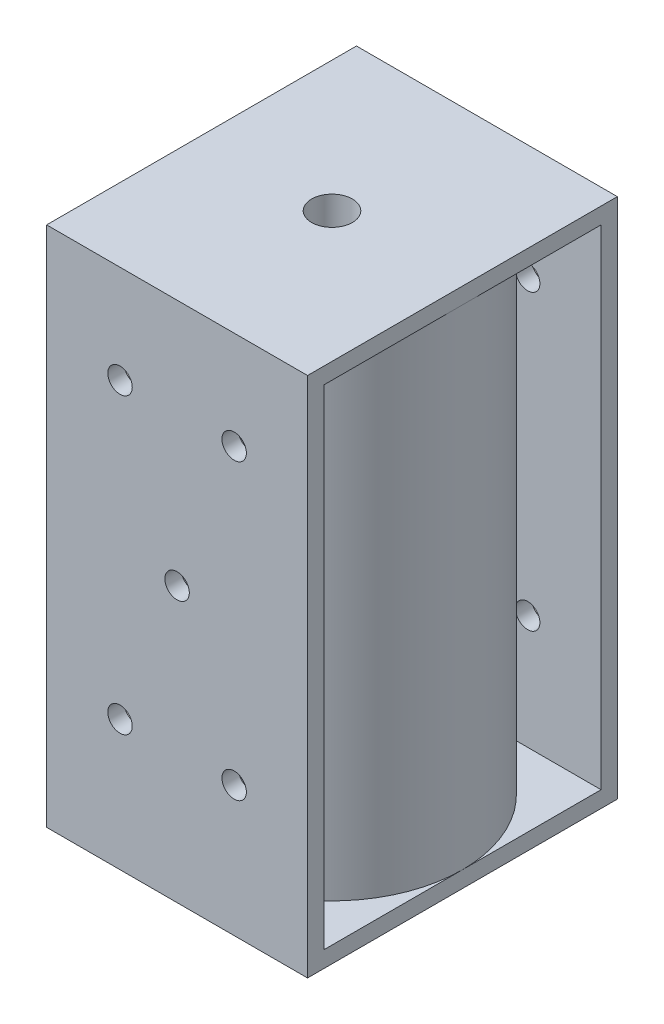
ISO-10303-21;
HEADER;
FILE_DESCRIPTION(('STEP AP214'),'2;1');
FILE_NAME('part.step','',(''),(''),'','','');
FILE_SCHEMA(('AUTOMOTIVE_DESIGN { 1 0 10303 214 1 1 1 1 }'));
ENDSEC;
DATA;
#1=APPLICATION_CONTEXT('core data for automotive mechanical design processes');
#2=APPLICATION_PROTOCOL_DEFINITION('international standard','automotive_design',2000,#1);
#3=PRODUCT_CONTEXT('',#1,'mechanical');
#4=PRODUCT('Part','Part','',(#3));
#5=PRODUCT_RELATED_PRODUCT_CATEGORY('part','',(#4));
#6=PRODUCT_DEFINITION_FORMATION('','',#4);
#7=PRODUCT_DEFINITION_CONTEXT('part definition',#1,'design');
#8=PRODUCT_DEFINITION('design','',#6,#7);
#9=PRODUCT_DEFINITION_SHAPE('','',#8);
#10=(LENGTH_UNIT() NAMED_UNIT(*) SI_UNIT(.MILLI.,.METRE.));
#11=(NAMED_UNIT(*) PLANE_ANGLE_UNIT() SI_UNIT($,.RADIAN.));
#12=(NAMED_UNIT(*) SI_UNIT($,.STERADIAN.) SOLID_ANGLE_UNIT());
#13=UNCERTAINTY_MEASURE_WITH_UNIT(LENGTH_MEASURE(1.E-05),#10,'distance_accuracy_value','');
#14=(GEOMETRIC_REPRESENTATION_CONTEXT(3) GLOBAL_UNCERTAINTY_ASSIGNED_CONTEXT((#13)) GLOBAL_UNIT_ASSIGNED_CONTEXT((#10,
#11,#12)) REPRESENTATION_CONTEXT('',''));
#15=CARTESIAN_POINT('',(0.,0.,0.));
#16=DIRECTION('',(0.,0.,1.));
#17=DIRECTION('',(1.,0.,0.));
#18=AXIS2_PLACEMENT_3D('',#15,#16,#17);
#19=CARTESIAN_POINT('',(16.,-32.,0.));
#20=DIRECTION('',(0.,1.,0.));
#21=DIRECTION('',(0.,0.,1.));
#22=AXIS2_PLACEMENT_3D('',#19,#20,#21);
#23=CYLINDRICAL_SURFACE('',#22,2.5);
#24=CARTESIAN_POINT('',(16.,32.,0.));
#25=DIRECTION('',(0.,1.,0.));
#26=DIRECTION('',(0.,0.,1.));
#27=AXIS2_PLACEMENT_3D('',#24,#25,#26);
#28=CIRCLE('',#27,2.5);
#29=CARTESIAN_POINT('',(16.,32.,2.5));
#30=VERTEX_POINT('',#29);
#31=EDGE_CURVE('E120',#30,#30,#28,.T.);
#32=ORIENTED_EDGE('',*,*,#31,.T.);
#33=EDGE_LOOP('',(#32));
#34=FACE_BOUND('',#33,.T.);
#35=CARTESIAN_POINT('',(16.,8.00000000000001,0.));
#36=DIRECTION('',(0.,-1.,0.));
#37=DIRECTION('',(0.,0.,-1.));
#38=AXIS2_PLACEMENT_3D('',#35,#36,#37);
#39=CIRCLE('',#38,2.5);
#40=CARTESIAN_POINT('',(16.,8.00000000000001,-2.5));
#41=VERTEX_POINT('',#40);
#42=EDGE_CURVE('E36',#41,#41,#39,.F.);
#43=ORIENTED_EDGE('',*,*,#42,.F.);
#44=EDGE_LOOP('',(#43));
#45=FACE_BOUND('',#44,.T.);
#46=ADVANCED_FACE('F32',(#34,#45),#23,.F.);
#47=CARTESIAN_POINT('',(32.,-30.,17.));
#48=DIRECTION('',(0.,1.,0.));
#49=DIRECTION('',(0.,0.,1.));
#50=AXIS2_PLACEMENT_3D('',#47,#48,#49);
#51=PLANE('',#50);
#52=DIRECTION('',(0.,0.,-1.));
#53=VECTOR('',#52,1.);
#54=CARTESIAN_POINT('',(0.,-30.,17.));
#55=LINE('',#54,#53);
#56=CARTESIAN_POINT('',(0.,-29.9999999999727,0.));
#57=VERTEX_POINT('',#56);
#58=CARTESIAN_POINT('',(0.,-30.,-17.));
#59=VERTEX_POINT('',#58);
#60=EDGE_CURVE('E144',#57,#59,#55,.T.);
#61=ORIENTED_EDGE('',*,*,#60,.F.);
#62=CARTESIAN_POINT('',(16.,-30.,0.));
#63=DIRECTION('',(0.,1.,0.));
#64=DIRECTION('',(0.,0.,1.));
#65=AXIS2_PLACEMENT_3D('',#62,#63,#64);
#66=CIRCLE('',#65,16.);
#67=CARTESIAN_POINT('',(32.,-30.,0.));
#68=VERTEX_POINT('',#67);
#69=EDGE_CURVE('E47',#68,#57,#66,.T.);
#70=ORIENTED_EDGE('',*,*,#69,.F.);
#71=DIRECTION('',(0.,0.,-1.));
#72=VECTOR('',#71,1.);
#73=CARTESIAN_POINT('',(32.,-30.,17.));
#74=LINE('',#73,#72);
#75=CARTESIAN_POINT('',(32.,-30.,-17.));
#76=VERTEX_POINT('',#75);
#77=EDGE_CURVE('E152',#68,#76,#74,.T.);
#78=ORIENTED_EDGE('',*,*,#77,.T.);
#79=DIRECTION('',(-1.,0.,0.));
#80=VECTOR('',#79,1.);
#81=CARTESIAN_POINT('',(32.,-30.,-17.));
#82=LINE('',#81,#80);
#83=EDGE_CURVE('E158',#76,#59,#82,.T.);
#84=ORIENTED_EDGE('',*,*,#83,.T.);
#85=EDGE_LOOP('',(#61,#70,#78,#84));
#86=FACE_BOUND('',#85,.T.);
#87=ADVANCED_FACE('F236',(#86),#51,.T.);
#88=CARTESIAN_POINT('',(32.,30.,17.));
#89=DIRECTION('',(0.,-1.,0.));
#90=DIRECTION('',(0.,0.,-1.));
#91=AXIS2_PLACEMENT_3D('',#88,#89,#90);
#92=PLANE('',#91);
#93=DIRECTION('',(0.,0.,1.));
#94=VECTOR('',#93,1.);
#95=CARTESIAN_POINT('',(0.,30.,17.));
#96=LINE('',#95,#94);
#97=CARTESIAN_POINT('',(0.,29.9999999999727,0.));
#98=VERTEX_POINT('',#97);
#99=CARTESIAN_POINT('',(0.,30.,17.));
#100=VERTEX_POINT('',#99);
#101=EDGE_CURVE('E117',#98,#100,#96,.T.);
#102=ORIENTED_EDGE('',*,*,#101,.F.);
#103=CARTESIAN_POINT('',(16.,29.9999999999727,0.));
#104=DIRECTION('',(0.,-1.,0.));
#105=DIRECTION('',(0.,0.,-1.));
#106=AXIS2_PLACEMENT_3D('',#103,#104,#105);
#107=CIRCLE('',#106,16.);
#108=CARTESIAN_POINT('',(32.,29.9999999999727,0.));
#109=VERTEX_POINT('',#108);
#110=EDGE_CURVE('E54',#109,#98,#107,.T.);
#111=ORIENTED_EDGE('',*,*,#110,.F.);
#112=DIRECTION('',(0.,0.,1.));
#113=VECTOR('',#112,1.);
#114=CARTESIAN_POINT('',(32.,30.,17.));
#115=LINE('',#114,#113);
#116=CARTESIAN_POINT('',(32.,30.,17.));
#117=VERTEX_POINT('',#116);
#118=EDGE_CURVE('E115',#109,#117,#115,.T.);
#119=ORIENTED_EDGE('',*,*,#118,.T.);
#120=DIRECTION('',(-1.,0.,0.));
#121=VECTOR('',#120,1.);
#122=CARTESIAN_POINT('',(32.,30.,17.));
#123=LINE('',#122,#121);
#124=EDGE_CURVE('E155',#117,#100,#123,.T.);
#125=ORIENTED_EDGE('',*,*,#124,.T.);
#126=EDGE_LOOP('',(#102,#111,#119,#125));
#127=FACE_BOUND('',#126,.T.);
#128=ADVANCED_FACE('F113',(#127),#92,.T.);
#129=CARTESIAN_POINT('',(32.,0.,0.));
#130=DIRECTION('',(-1.,0.,0.));
#131=DIRECTION('',(0.,0.,1.));
#132=AXIS2_PLACEMENT_3D('',#129,#130,#131);
#133=PLANE('',#132);
#134=DIRECTION('',(0.,1.,0.));
#135=VECTOR('',#134,1.);
#136=CARTESIAN_POINT('',(32.,-32.,-19.));
#137=LINE('',#136,#135);
#138=CARTESIAN_POINT('',(32.,-32.,-19.));
#139=VERTEX_POINT('',#138);
#140=CARTESIAN_POINT('',(32.,32.,-19.));
#141=VERTEX_POINT('',#140);
#142=EDGE_CURVE('E162',#139,#141,#137,.T.);
#143=ORIENTED_EDGE('',*,*,#142,.T.);
#144=DIRECTION('',(0.,0.,1.));
#145=VECTOR('',#144,1.);
#146=CARTESIAN_POINT('',(32.,32.,19.));
#147=LINE('',#146,#145);
#148=CARTESIAN_POINT('',(32.,32.,19.));
#149=VERTEX_POINT('',#148);
#150=EDGE_CURVE('E165',#141,#149,#147,.T.);
#151=ORIENTED_EDGE('',*,*,#150,.T.);
#152=DIRECTION('',(0.,-1.,0.));
#153=VECTOR('',#152,1.);
#154=CARTESIAN_POINT('',(32.,-32.,19.));
#155=LINE('',#154,#153);
#156=CARTESIAN_POINT('',(32.,-32.,19.));
#157=VERTEX_POINT('',#156);
#158=EDGE_CURVE('E168',#149,#157,#155,.T.);
#159=ORIENTED_EDGE('',*,*,#158,.T.);
#160=DIRECTION('',(0.,0.,-1.));
#161=VECTOR('',#160,1.);
#162=CARTESIAN_POINT('',(32.,-32.,19.));
#163=LINE('',#162,#161);
#164=EDGE_CURVE('E170',#157,#139,#163,.T.);
#165=ORIENTED_EDGE('',*,*,#164,.T.);
#166=EDGE_LOOP('',(#143,#151,#159,#165));
#167=FACE_BOUND('',#166,.T.);
#168=CARTESIAN_POINT('',(32.,-30.,17.));
#169=VERTEX_POINT('',#168);
#170=EDGE_CURVE('E228',#169,#68,#74,.T.);
#171=ORIENTED_EDGE('',*,*,#170,.F.);
#172=DIRECTION('',(0.,-1.,0.));
#173=VECTOR('',#172,1.);
#174=CARTESIAN_POINT('',(32.,-30.,17.));
#175=LINE('',#174,#173);
#176=EDGE_CURVE('E129',#117,#169,#175,.T.);
#177=ORIENTED_EDGE('',*,*,#176,.F.);
#178=ORIENTED_EDGE('',*,*,#118,.F.);
#179=CARTESIAN_POINT('',(32.,30.,-17.));
#180=VERTEX_POINT('',#179);
#181=EDGE_CURVE('E128',#180,#109,#115,.T.);
#182=ORIENTED_EDGE('',*,*,#181,.F.);
#183=DIRECTION('',(0.,1.,0.));
#184=VECTOR('',#183,1.);
#185=CARTESIAN_POINT('',(32.,-30.,-17.));
#186=LINE('',#185,#184);
#187=EDGE_CURVE('E130',#76,#180,#186,.T.);
#188=ORIENTED_EDGE('',*,*,#187,.F.);
#189=ORIENTED_EDGE('',*,*,#77,.F.);
#190=EDGE_LOOP('',(#171,#177,#178,#182,#188,#189));
#191=FACE_BOUND('',#190,.T.);
#192=ADVANCED_FACE('F126',(#167,#191),#133,.F.);
#193=CARTESIAN_POINT('',(0.,0.,0.));
#194=DIRECTION('',(-1.,0.,0.));
#195=DIRECTION('',(0.,0.,1.));
#196=AXIS2_PLACEMENT_3D('',#193,#194,#195);
#197=PLANE('',#196);
#198=DIRECTION('',(0.,1.,0.));
#199=VECTOR('',#198,1.);
#200=CARTESIAN_POINT('',(0.,-32.,-19.));
#201=LINE('',#200,#199);
#202=CARTESIAN_POINT('',(0.,-32.,-19.));
#203=VERTEX_POINT('',#202);
#204=CARTESIAN_POINT('',(0.,32.,-19.));
#205=VERTEX_POINT('',#204);
#206=EDGE_CURVE('E161',#203,#205,#201,.T.);
#207=ORIENTED_EDGE('',*,*,#206,.F.);
#208=DIRECTION('',(0.,0.,-1.));
#209=VECTOR('',#208,1.);
#210=CARTESIAN_POINT('',(0.,-32.,19.));
#211=LINE('',#210,#209);
#212=CARTESIAN_POINT('',(0.,-32.,19.));
#213=VERTEX_POINT('',#212);
#214=EDGE_CURVE('E166',#213,#203,#211,.T.);
#215=ORIENTED_EDGE('',*,*,#214,.F.);
#216=DIRECTION('',(0.,-1.,0.));
#217=VECTOR('',#216,1.);
#218=CARTESIAN_POINT('',(0.,-32.,19.));
#219=LINE('',#218,#217);
#220=CARTESIAN_POINT('',(0.,32.,19.));
#221=VERTEX_POINT('',#220);
#222=EDGE_CURVE('E177',#221,#213,#219,.T.);
#223=ORIENTED_EDGE('',*,*,#222,.F.);
#224=DIRECTION('',(0.,0.,1.));
#225=VECTOR('',#224,1.);
#226=CARTESIAN_POINT('',(0.,32.,19.));
#227=LINE('',#226,#225);
#228=EDGE_CURVE('E175',#205,#221,#227,.T.);
#229=ORIENTED_EDGE('',*,*,#228,.F.);
#230=EDGE_LOOP('',(#207,#215,#223,#229));
#231=FACE_BOUND('',#230,.T.);
#232=DIRECTION('',(0.,-1.,0.));
#233=VECTOR('',#232,1.);
#234=CARTESIAN_POINT('',(0.,-30.,17.));
#235=LINE('',#234,#233);
#236=CARTESIAN_POINT('',(0.,-30.,17.));
#237=VERTEX_POINT('',#236);
#238=EDGE_CURVE('E149',#100,#237,#235,.T.);
#239=ORIENTED_EDGE('',*,*,#238,.T.);
#240=EDGE_CURVE('E140',#237,#57,#55,.T.);
#241=ORIENTED_EDGE('',*,*,#240,.T.);
#242=ORIENTED_EDGE('',*,*,#60,.T.);
#243=DIRECTION('',(0.,1.,0.));
#244=VECTOR('',#243,1.);
#245=CARTESIAN_POINT('',(0.,-30.,-17.));
#246=LINE('',#245,#244);
#247=CARTESIAN_POINT('',(0.,30.,-17.));
#248=VERTEX_POINT('',#247);
#249=EDGE_CURVE('E143',#59,#248,#246,.T.);
#250=ORIENTED_EDGE('',*,*,#249,.T.);
#251=EDGE_CURVE('E147',#248,#98,#96,.T.);
#252=ORIENTED_EDGE('',*,*,#251,.T.);
#253=ORIENTED_EDGE('',*,*,#101,.T.);
#254=EDGE_LOOP('',(#239,#241,#242,#250,#252,#253));
#255=FACE_BOUND('',#254,.T.);
#256=ADVANCED_FACE('F241',(#231,#255),#197,.T.);
#257=CARTESIAN_POINT('',(32.,-32.,-19.));
#258=DIRECTION('',(0.,0.,1.));
#259=DIRECTION('',(1.,0.,0.));
#260=AXIS2_PLACEMENT_3D('',#257,#258,#259);
#261=PLANE('',#260);
#262=CARTESIAN_POINT('',(23.,20.,-19.));
#263=DIRECTION('',(0.,0.,1.));
#264=DIRECTION('',(1.,0.,0.));
#265=AXIS2_PLACEMENT_3D('',#262,#263,#264);
#266=CIRCLE('',#265,1.5);
#267=CARTESIAN_POINT('',(24.5,20.,-19.));
#268=VERTEX_POINT('',#267);
#269=EDGE_CURVE('E199',#268,#268,#266,.T.);
#270=ORIENTED_EDGE('',*,*,#269,.T.);
#271=EDGE_LOOP('',(#270));
#272=FACE_BOUND('',#271,.T.);
#273=CARTESIAN_POINT('',(16.,1.6635217326557,-19.));
#274=DIRECTION('',(0.,0.,1.));
#275=DIRECTION('',(1.,0.,0.));
#276=AXIS2_PLACEMENT_3D('',#273,#274,#275);
#277=CIRCLE('',#276,1.5);
#278=CARTESIAN_POINT('',(17.5,1.6635217326557,-19.));
#279=VERTEX_POINT('',#278);
#280=EDGE_CURVE('E325',#279,#279,#277,.T.);
#281=ORIENTED_EDGE('',*,*,#280,.T.);
#282=EDGE_LOOP('',(#281));
#283=FACE_BOUND('',#282,.T.);
#284=CARTESIAN_POINT('',(9.00000000000001,-16.,-19.));
#285=DIRECTION('',(0.,0.,1.));
#286=DIRECTION('',(1.,0.,0.));
#287=AXIS2_PLACEMENT_3D('',#284,#285,#286);
#288=CIRCLE('',#287,1.5);
#289=CARTESIAN_POINT('',(10.5,-16.,-19.));
#290=VERTEX_POINT('',#289);
#291=EDGE_CURVE('E315',#290,#290,#288,.T.);
#292=ORIENTED_EDGE('',*,*,#291,.T.);
#293=EDGE_LOOP('',(#292));
#294=FACE_BOUND('',#293,.T.);
#295=CARTESIAN_POINT('',(23.,-16.,-19.));
#296=DIRECTION('',(0.,0.,1.));
#297=DIRECTION('',(1.,0.,0.));
#298=AXIS2_PLACEMENT_3D('',#295,#296,#297);
#299=CIRCLE('',#298,1.5);
#300=CARTESIAN_POINT('',(24.5,-16.,-19.));
#301=VERTEX_POINT('',#300);
#302=EDGE_CURVE('E309',#301,#301,#299,.T.);
#303=ORIENTED_EDGE('',*,*,#302,.T.);
#304=EDGE_LOOP('',(#303));
#305=FACE_BOUND('',#304,.T.);
#306=CARTESIAN_POINT('',(9.,20.,-19.));
#307=DIRECTION('',(0.,0.,1.));
#308=DIRECTION('',(1.,0.,0.));
#309=AXIS2_PLACEMENT_3D('',#306,#307,#308);
#310=CIRCLE('',#309,1.5);
#311=CARTESIAN_POINT('',(10.5,20.,-19.));
#312=VERTEX_POINT('',#311);
#313=EDGE_CURVE('E194',#312,#312,#310,.T.);
#314=ORIENTED_EDGE('',*,*,#313,.T.);
#315=EDGE_LOOP('',(#314));
#316=FACE_BOUND('',#315,.T.);
#317=ORIENTED_EDGE('',*,*,#206,.T.);
#318=DIRECTION('',(-1.,0.,0.));
#319=VECTOR('',#318,1.);
#320=CARTESIAN_POINT('',(32.,32.,-19.));
#321=LINE('',#320,#319);
#322=EDGE_CURVE('E41',#141,#205,#321,.T.);
#323=ORIENTED_EDGE('',*,*,#322,.F.);
#324=ORIENTED_EDGE('',*,*,#142,.F.);
#325=DIRECTION('',(-1.,0.,0.));
#326=VECTOR('',#325,1.);
#327=CARTESIAN_POINT('',(32.,-32.,-19.));
#328=LINE('',#327,#326);
#329=EDGE_CURVE('E172',#139,#203,#328,.T.);
#330=ORIENTED_EDGE('',*,*,#329,.T.);
#331=EDGE_LOOP('',(#317,#323,#324,#330));
#332=FACE_BOUND('',#331,.T.);
#333=ADVANCED_FACE('F34',(#272,#283,#294,#305,#316,#332),#261,.F.);
#334=CARTESIAN_POINT('',(32.,32.,19.));
#335=DIRECTION('',(0.,-1.,0.));
#336=DIRECTION('',(0.,0.,-1.));
#337=AXIS2_PLACEMENT_3D('',#334,#335,#336);
#338=PLANE('',#337);
#339=ORIENTED_EDGE('',*,*,#31,.F.);
#340=EDGE_LOOP('',(#339));
#341=FACE_BOUND('',#340,.T.);
#342=ORIENTED_EDGE('',*,*,#228,.T.);
#343=DIRECTION('',(-1.,0.,0.));
#344=VECTOR('',#343,1.);
#345=CARTESIAN_POINT('',(32.,32.,19.));
#346=LINE('',#345,#344);
#347=EDGE_CURVE('E185',#149,#221,#346,.T.);
#348=ORIENTED_EDGE('',*,*,#347,.F.);
#349=ORIENTED_EDGE('',*,*,#150,.F.);
#350=ORIENTED_EDGE('',*,*,#322,.T.);
#351=EDGE_LOOP('',(#342,#348,#349,#350));
#352=FACE_BOUND('',#351,.T.);
#353=ADVANCED_FACE('F372',(#341,#352),#338,.F.);
#354=CARTESIAN_POINT('',(32.,-32.,19.));
#355=DIRECTION('',(0.,0.,-1.));
#356=DIRECTION('',(-1.,0.,0.));
#357=AXIS2_PLACEMENT_3D('',#354,#355,#356);
#358=PLANE('',#357);
#359=CARTESIAN_POINT('',(23.,20.,19.));
#360=DIRECTION('',(0.,0.,1.));
#361=DIRECTION('',(1.,0.,0.));
#362=AXIS2_PLACEMENT_3D('',#359,#360,#361);
#363=CIRCLE('',#362,1.5);
#364=CARTESIAN_POINT('',(24.5,20.,19.));
#365=VERTEX_POINT('',#364);
#366=EDGE_CURVE('E328',#365,#365,#363,.T.);
#367=ORIENTED_EDGE('',*,*,#366,.F.);
#368=EDGE_LOOP('',(#367));
#369=FACE_BOUND('',#368,.T.);
#370=CARTESIAN_POINT('',(16.,1.6635217326557,19.));
#371=DIRECTION('',(0.,0.,1.));
#372=DIRECTION('',(1.,0.,0.));
#373=AXIS2_PLACEMENT_3D('',#370,#371,#372);
#374=CIRCLE('',#373,1.5);
#375=CARTESIAN_POINT('',(17.5,1.6635217326557,19.));
#376=VERTEX_POINT('',#375);
#377=EDGE_CURVE('E322',#376,#376,#374,.T.);
#378=ORIENTED_EDGE('',*,*,#377,.F.);
#379=EDGE_LOOP('',(#378));
#380=FACE_BOUND('',#379,.T.);
#381=CARTESIAN_POINT('',(9.00000000000001,-16.,19.));
#382=DIRECTION('',(0.,0.,1.));
#383=DIRECTION('',(1.,0.,0.));
#384=AXIS2_PLACEMENT_3D('',#381,#382,#383);
#385=CIRCLE('',#384,1.5);
#386=CARTESIAN_POINT('',(10.5,-16.,19.));
#387=VERTEX_POINT('',#386);
#388=EDGE_CURVE('E311',#387,#387,#385,.T.);
#389=ORIENTED_EDGE('',*,*,#388,.F.);
#390=EDGE_LOOP('',(#389));
#391=FACE_BOUND('',#390,.T.);
#392=CARTESIAN_POINT('',(23.,-16.,19.));
#393=DIRECTION('',(0.,0.,1.));
#394=DIRECTION('',(1.,0.,0.));
#395=AXIS2_PLACEMENT_3D('',#392,#393,#394);
#396=CIRCLE('',#395,1.5);
#397=CARTESIAN_POINT('',(24.5,-16.,19.));
#398=VERTEX_POINT('',#397);
#399=EDGE_CURVE('E312',#398,#398,#396,.T.);
#400=ORIENTED_EDGE('',*,*,#399,.F.);
#401=EDGE_LOOP('',(#400));
#402=FACE_BOUND('',#401,.T.);
#403=CARTESIAN_POINT('',(9.,20.,19.));
#404=DIRECTION('',(0.,0.,1.));
#405=DIRECTION('',(1.,0.,0.));
#406=AXIS2_PLACEMENT_3D('',#403,#404,#405);
#407=CIRCLE('',#406,1.5);
#408=CARTESIAN_POINT('',(10.5,20.,19.));
#409=VERTEX_POINT('',#408);
#410=EDGE_CURVE('E214',#409,#409,#407,.T.);
#411=ORIENTED_EDGE('',*,*,#410,.F.);
#412=EDGE_LOOP('',(#411));
#413=FACE_BOUND('',#412,.T.);
#414=ORIENTED_EDGE('',*,*,#222,.T.);
#415=DIRECTION('',(-1.,0.,0.));
#416=VECTOR('',#415,1.);
#417=CARTESIAN_POINT('',(32.,-32.,19.));
#418=LINE('',#417,#416);
#419=EDGE_CURVE('E182',#157,#213,#418,.T.);
#420=ORIENTED_EDGE('',*,*,#419,.F.);
#421=ORIENTED_EDGE('',*,*,#158,.F.);
#422=ORIENTED_EDGE('',*,*,#347,.T.);
#423=EDGE_LOOP('',(#414,#420,#421,#422));
#424=FACE_BOUND('',#423,.T.);
#425=ADVANCED_FACE('F358',(#369,#380,#391,#402,#413,#424),#358,.F.);
#426=CARTESIAN_POINT('',(32.,-32.,19.));
#427=DIRECTION('',(0.,1.,0.));
#428=DIRECTION('',(0.,0.,1.));
#429=AXIS2_PLACEMENT_3D('',#426,#427,#428);
#430=PLANE('',#429);
#431=CARTESIAN_POINT('',(16.,-32.,0.));
#432=DIRECTION('',(0.,-1.,0.));
#433=DIRECTION('',(0.,0.,-1.));
#434=AXIS2_PLACEMENT_3D('',#431,#432,#433);
#435=CIRCLE('',#434,6.);
#436=CARTESIAN_POINT('',(16.,-32.,-6.));
#437=VERTEX_POINT('',#436);
#438=EDGE_CURVE('E335',#437,#437,#435,.T.);
#439=ORIENTED_EDGE('',*,*,#438,.F.);
#440=EDGE_LOOP('',(#439));
#441=FACE_BOUND('',#440,.T.);
#442=ORIENTED_EDGE('',*,*,#214,.T.);
#443=ORIENTED_EDGE('',*,*,#329,.F.);
#444=ORIENTED_EDGE('',*,*,#164,.F.);
#445=ORIENTED_EDGE('',*,*,#419,.T.);
#446=EDGE_LOOP('',(#442,#443,#444,#445));
#447=FACE_BOUND('',#446,.T.);
#448=ADVANCED_FACE('F355',(#441,#447),#430,.F.);
#449=ORIENTED_EDGE('',*,*,#170,.T.);
#450=EDGE_CURVE('E119',#57,#68,#66,.T.);
#451=ORIENTED_EDGE('',*,*,#450,.F.);
#452=ORIENTED_EDGE('',*,*,#240,.F.);
#453=DIRECTION('',(-1.,0.,0.));
#454=VECTOR('',#453,1.);
#455=CARTESIAN_POINT('',(32.,-30.,17.));
#456=LINE('',#455,#454);
#457=EDGE_CURVE('E135',#169,#237,#456,.T.);
#458=ORIENTED_EDGE('',*,*,#457,.F.);
#459=EDGE_LOOP('',(#449,#451,#452,#458));
#460=FACE_BOUND('',#459,.T.);
#461=ADVANCED_FACE('F243',(#460),#51,.T.);
#462=CARTESIAN_POINT('',(32.,-30.,-17.));
#463=DIRECTION('',(0.,0.,1.));
#464=DIRECTION('',(1.,0.,0.));
#465=AXIS2_PLACEMENT_3D('',#462,#463,#464);
#466=PLANE('',#465);
#467=CARTESIAN_POINT('',(23.,20.,-17.));
#468=DIRECTION('',(0.,0.,1.));
#469=DIRECTION('',(1.,0.,0.));
#470=AXIS2_PLACEMENT_3D('',#467,#468,#469);
#471=CIRCLE('',#470,1.5);
#472=CARTESIAN_POINT('',(24.5,20.,-17.));
#473=VERTEX_POINT('',#472);
#474=EDGE_CURVE('E210',#473,#473,#471,.T.);
#475=ORIENTED_EDGE('',*,*,#474,.F.);
#476=EDGE_LOOP('',(#475));
#477=FACE_BOUND('',#476,.T.);
#478=CARTESIAN_POINT('',(16.,1.6635217326557,-17.));
#479=DIRECTION('',(0.,0.,1.));
#480=DIRECTION('',(1.,0.,0.));
#481=AXIS2_PLACEMENT_3D('',#478,#479,#480);
#482=CIRCLE('',#481,1.5);
#483=CARTESIAN_POINT('',(17.5,1.6635217326557,-17.));
#484=VERTEX_POINT('',#483);
#485=EDGE_CURVE('E207',#484,#484,#482,.T.);
#486=ORIENTED_EDGE('',*,*,#485,.F.);
#487=EDGE_LOOP('',(#486));
#488=FACE_BOUND('',#487,.T.);
#489=CARTESIAN_POINT('',(9.00000000000001,-16.,-17.));
#490=DIRECTION('',(0.,0.,1.));
#491=DIRECTION('',(1.,0.,0.));
#492=AXIS2_PLACEMENT_3D('',#489,#490,#491);
#493=CIRCLE('',#492,1.5);
#494=CARTESIAN_POINT('',(10.5,-16.,-17.));
#495=VERTEX_POINT('',#494);
#496=EDGE_CURVE('E203',#495,#495,#493,.T.);
#497=ORIENTED_EDGE('',*,*,#496,.F.);
#498=EDGE_LOOP('',(#497));
#499=FACE_BOUND('',#498,.T.);
#500=CARTESIAN_POINT('',(23.,-16.,-17.));
#501=DIRECTION('',(0.,0.,1.));
#502=DIRECTION('',(1.,0.,0.));
#503=AXIS2_PLACEMENT_3D('',#500,#501,#502);
#504=CIRCLE('',#503,1.5);
#505=CARTESIAN_POINT('',(24.5,-16.,-17.));
#506=VERTEX_POINT('',#505);
#507=EDGE_CURVE('E198',#506,#506,#504,.T.);
#508=ORIENTED_EDGE('',*,*,#507,.F.);
#509=EDGE_LOOP('',(#508));
#510=FACE_BOUND('',#509,.T.);
#511=CARTESIAN_POINT('',(9.,20.,-17.));
#512=DIRECTION('',(0.,0.,1.));
#513=DIRECTION('',(1.,0.,0.));
#514=AXIS2_PLACEMENT_3D('',#511,#512,#513);
#515=CIRCLE('',#514,1.5);
#516=CARTESIAN_POINT('',(10.5,20.,-17.));
#517=VERTEX_POINT('',#516);
#518=EDGE_CURVE('E193',#517,#517,#515,.T.);
#519=ORIENTED_EDGE('',*,*,#518,.F.);
#520=EDGE_LOOP('',(#519));
#521=FACE_BOUND('',#520,.T.);
#522=ORIENTED_EDGE('',*,*,#249,.F.);
#523=ORIENTED_EDGE('',*,*,#83,.F.);
#524=ORIENTED_EDGE('',*,*,#187,.T.);
#525=DIRECTION('',(-1.,0.,0.));
#526=VECTOR('',#525,1.);
#527=CARTESIAN_POINT('',(32.,30.,-17.));
#528=LINE('',#527,#526);
#529=EDGE_CURVE('E134',#180,#248,#528,.T.);
#530=ORIENTED_EDGE('',*,*,#529,.T.);
#531=EDGE_LOOP('',(#522,#523,#524,#530));
#532=FACE_BOUND('',#531,.T.);
#533=ADVANCED_FACE('F239',(#477,#488,#499,#510,#521,#532),#466,.T.);
#534=ORIENTED_EDGE('',*,*,#181,.T.);
#535=CARTESIAN_POINT('',(16.,29.9999999999727,0.));
#536=DIRECTION('',(0.,-1.,0.));
#537=DIRECTION('',(0.,0.,-1.));
#538=AXIS2_PLACEMENT_3D('',#535,#536,#537);
#539=CIRCLE('',#538,16.);
#540=EDGE_CURVE('E11',#109,#98,#539,.F.);
#541=ORIENTED_EDGE('',*,*,#540,.T.);
#542=ORIENTED_EDGE('',*,*,#251,.F.);
#543=ORIENTED_EDGE('',*,*,#529,.F.);
#544=EDGE_LOOP('',(#534,#541,#542,#543));
#545=FACE_BOUND('',#544,.T.);
#546=ADVANCED_FACE('F133',(#545),#92,.T.);
#547=CARTESIAN_POINT('',(32.,-30.,17.));
#548=DIRECTION('',(0.,0.,-1.));
#549=DIRECTION('',(-1.,0.,0.));
#550=AXIS2_PLACEMENT_3D('',#547,#548,#549);
#551=PLANE('',#550);
#552=CARTESIAN_POINT('',(23.,20.,17.));
#553=DIRECTION('',(0.,0.,-1.));
#554=DIRECTION('',(-1.,0.,0.));
#555=AXIS2_PLACEMENT_3D('',#552,#553,#554);
#556=CIRCLE('',#555,1.5);
#557=CARTESIAN_POINT('',(21.5,20.,17.));
#558=VERTEX_POINT('',#557);
#559=EDGE_CURVE('E208',#558,#558,#556,.T.);
#560=ORIENTED_EDGE('',*,*,#559,.F.);
#561=EDGE_LOOP('',(#560));
#562=FACE_BOUND('',#561,.T.);
#563=CARTESIAN_POINT('',(16.,1.6635217326557,17.));
#564=DIRECTION('',(0.,0.,-1.));
#565=DIRECTION('',(-1.,0.,0.));
#566=AXIS2_PLACEMENT_3D('',#563,#564,#565);
#567=CIRCLE('',#566,1.5);
#568=CARTESIAN_POINT('',(14.5,1.6635217326557,17.));
#569=VERTEX_POINT('',#568);
#570=EDGE_CURVE('E204',#569,#569,#567,.T.);
#571=ORIENTED_EDGE('',*,*,#570,.F.);
#572=EDGE_LOOP('',(#571));
#573=FACE_BOUND('',#572,.T.);
#574=CARTESIAN_POINT('',(9.00000000000001,-16.,17.));
#575=DIRECTION('',(0.,0.,-1.));
#576=DIRECTION('',(-1.,0.,0.));
#577=AXIS2_PLACEMENT_3D('',#574,#575,#576);
#578=CIRCLE('',#577,1.5);
#579=CARTESIAN_POINT('',(7.5,-16.,17.));
#580=VERTEX_POINT('',#579);
#581=EDGE_CURVE('E200',#580,#580,#578,.T.);
#582=ORIENTED_EDGE('',*,*,#581,.F.);
#583=EDGE_LOOP('',(#582));
#584=FACE_BOUND('',#583,.T.);
#585=CARTESIAN_POINT('',(23.,-16.,17.));
#586=DIRECTION('',(0.,0.,-1.));
#587=DIRECTION('',(-1.,0.,0.));
#588=AXIS2_PLACEMENT_3D('',#585,#586,#587);
#589=CIRCLE('',#588,1.5);
#590=CARTESIAN_POINT('',(21.5,-16.,17.));
#591=VERTEX_POINT('',#590);
#592=EDGE_CURVE('E195',#591,#591,#589,.T.);
#593=ORIENTED_EDGE('',*,*,#592,.F.);
#594=EDGE_LOOP('',(#593));
#595=FACE_BOUND('',#594,.T.);
#596=CARTESIAN_POINT('',(9.,20.,17.));
#597=DIRECTION('',(0.,0.,-1.));
#598=DIRECTION('',(-1.,0.,0.));
#599=AXIS2_PLACEMENT_3D('',#596,#597,#598);
#600=CIRCLE('',#599,1.5);
#601=CARTESIAN_POINT('',(7.5,20.,17.));
#602=VERTEX_POINT('',#601);
#603=EDGE_CURVE('E190',#602,#602,#600,.T.);
#604=ORIENTED_EDGE('',*,*,#603,.F.);
#605=EDGE_LOOP('',(#604));
#606=FACE_BOUND('',#605,.T.);
#607=ORIENTED_EDGE('',*,*,#238,.F.);
#608=ORIENTED_EDGE('',*,*,#124,.F.);
#609=ORIENTED_EDGE('',*,*,#176,.T.);
#610=ORIENTED_EDGE('',*,*,#457,.T.);
#611=EDGE_LOOP('',(#607,#608,#609,#610));
#612=FACE_BOUND('',#611,.T.);
#613=ADVANCED_FACE('F245',(#562,#573,#584,#595,#606,#612),#551,.T.);
#614=CARTESIAN_POINT('',(9.,20.,-19.));
#615=DIRECTION('',(0.,0.,1.));
#616=DIRECTION('',(1.,0.,0.));
#617=AXIS2_PLACEMENT_3D('',#614,#615,#616);
#618=CYLINDRICAL_SURFACE('',#617,1.5);
#619=ORIENTED_EDGE('',*,*,#603,.T.);
#620=EDGE_LOOP('',(#619));
#621=FACE_BOUND('',#620,.T.);
#622=ORIENTED_EDGE('',*,*,#410,.T.);
#623=EDGE_LOOP('',(#622));
#624=FACE_BOUND('',#623,.T.);
#625=ADVANCED_FACE('F247',(#621,#624),#618,.F.);
#626=ORIENTED_EDGE('',*,*,#518,.T.);
#627=EDGE_LOOP('',(#626));
#628=FACE_BOUND('',#627,.T.);
#629=ORIENTED_EDGE('',*,*,#313,.F.);
#630=EDGE_LOOP('',(#629));
#631=FACE_BOUND('',#630,.T.);
#632=ADVANCED_FACE('F254',(#628,#631),#618,.F.);
#633=CARTESIAN_POINT('',(23.,-16.,-19.));
#634=DIRECTION('',(0.,0.,1.));
#635=DIRECTION('',(1.,0.,0.));
#636=AXIS2_PLACEMENT_3D('',#633,#634,#635);
#637=CYLINDRICAL_SURFACE('',#636,1.5);
#638=ORIENTED_EDGE('',*,*,#592,.T.);
#639=EDGE_LOOP('',(#638));
#640=FACE_BOUND('',#639,.T.);
#641=ORIENTED_EDGE('',*,*,#399,.T.);
#642=EDGE_LOOP('',(#641));
#643=FACE_BOUND('',#642,.T.);
#644=ADVANCED_FACE('F288',(#640,#643),#637,.F.);
#645=CARTESIAN_POINT('',(9.00000000000001,-16.,-19.));
#646=DIRECTION('',(0.,0.,1.));
#647=DIRECTION('',(1.,0.,0.));
#648=AXIS2_PLACEMENT_3D('',#645,#646,#647);
#649=CYLINDRICAL_SURFACE('',#648,1.5);
#650=ORIENTED_EDGE('',*,*,#581,.T.);
#651=EDGE_LOOP('',(#650));
#652=FACE_BOUND('',#651,.T.);
#653=ORIENTED_EDGE('',*,*,#388,.T.);
#654=EDGE_LOOP('',(#653));
#655=FACE_BOUND('',#654,.T.);
#656=ADVANCED_FACE('F283',(#652,#655),#649,.F.);
#657=CARTESIAN_POINT('',(16.,1.6635217326557,-19.));
#658=DIRECTION('',(0.,0.,1.));
#659=DIRECTION('',(1.,0.,0.));
#660=AXIS2_PLACEMENT_3D('',#657,#658,#659);
#661=CYLINDRICAL_SURFACE('',#660,1.5);
#662=ORIENTED_EDGE('',*,*,#570,.T.);
#663=EDGE_LOOP('',(#662));
#664=FACE_BOUND('',#663,.T.);
#665=ORIENTED_EDGE('',*,*,#377,.T.);
#666=EDGE_LOOP('',(#665));
#667=FACE_BOUND('',#666,.T.);
#668=ADVANCED_FACE('F280',(#664,#667),#661,.F.);
#669=CARTESIAN_POINT('',(23.,20.,-19.));
#670=DIRECTION('',(0.,0.,1.));
#671=DIRECTION('',(1.,0.,0.));
#672=AXIS2_PLACEMENT_3D('',#669,#670,#671);
#673=CYLINDRICAL_SURFACE('',#672,1.5);
#674=ORIENTED_EDGE('',*,*,#559,.T.);
#675=EDGE_LOOP('',(#674));
#676=FACE_BOUND('',#675,.T.);
#677=ORIENTED_EDGE('',*,*,#366,.T.);
#678=EDGE_LOOP('',(#677));
#679=FACE_BOUND('',#678,.T.);
#680=ADVANCED_FACE('F276',(#676,#679),#673,.F.);
#681=ORIENTED_EDGE('',*,*,#507,.T.);
#682=EDGE_LOOP('',(#681));
#683=FACE_BOUND('',#682,.T.);
#684=ORIENTED_EDGE('',*,*,#302,.F.);
#685=EDGE_LOOP('',(#684));
#686=FACE_BOUND('',#685,.T.);
#687=ADVANCED_FACE('F279',(#683,#686),#637,.F.);
#688=ORIENTED_EDGE('',*,*,#496,.T.);
#689=EDGE_LOOP('',(#688));
#690=FACE_BOUND('',#689,.T.);
#691=ORIENTED_EDGE('',*,*,#291,.F.);
#692=EDGE_LOOP('',(#691));
#693=FACE_BOUND('',#692,.T.);
#694=ADVANCED_FACE('F290',(#690,#693),#649,.F.);
#695=ORIENTED_EDGE('',*,*,#485,.T.);
#696=EDGE_LOOP('',(#695));
#697=FACE_BOUND('',#696,.T.);
#698=ORIENTED_EDGE('',*,*,#280,.F.);
#699=EDGE_LOOP('',(#698));
#700=FACE_BOUND('',#699,.T.);
#701=ADVANCED_FACE('F285',(#697,#700),#661,.F.);
#702=ORIENTED_EDGE('',*,*,#474,.T.);
#703=EDGE_LOOP('',(#702));
#704=FACE_BOUND('',#703,.T.);
#705=ORIENTED_EDGE('',*,*,#269,.F.);
#706=EDGE_LOOP('',(#705));
#707=FACE_BOUND('',#706,.T.);
#708=ADVANCED_FACE('F275',(#704,#707),#673,.F.);
#709=CARTESIAN_POINT('',(16.,500000.,0.));
#710=DIRECTION('',(0.,-1.,0.));
#711=DIRECTION('',(0.,0.,-1.));
#712=AXIS2_PLACEMENT_3D('',#709,#710,#711);
#713=CYLINDRICAL_SURFACE('',#712,16.);
#714=ORIENTED_EDGE('',*,*,#110,.T.);
#715=ORIENTED_EDGE('',*,*,#540,.F.);
#716=EDGE_LOOP('',(#714,#715));
#717=FACE_BOUND('',#716,.T.);
#718=ORIENTED_EDGE('',*,*,#69,.T.);
#719=ORIENTED_EDGE('',*,*,#450,.T.);
#720=EDGE_LOOP('',(#718,#719));
#721=FACE_BOUND('',#720,.T.);
#722=ADVANCED_FACE('F106',(#717,#721),#713,.T.);
#723=CARTESIAN_POINT('',(16.,8.00000000000001,0.));
#724=DIRECTION('',(0.,-1.,0.));
#725=DIRECTION('',(0.,0.,-1.));
#726=AXIS2_PLACEMENT_3D('',#723,#724,#725);
#727=PLANE('',#726);
#728=CARTESIAN_POINT('',(16.,8.00000000000001,0.));
#729=DIRECTION('',(0.,-1.,0.));
#730=DIRECTION('',(0.,0.,-1.));
#731=AXIS2_PLACEMENT_3D('',#728,#729,#730);
#732=CIRCLE('',#731,6.);
#733=CARTESIAN_POINT('',(16.,8.00000000000001,-6.));
#734=VERTEX_POINT('',#733);
#735=EDGE_CURVE('E338',#734,#734,#732,.T.);
#736=ORIENTED_EDGE('',*,*,#735,.T.);
#737=EDGE_LOOP('',(#736));
#738=FACE_BOUND('',#737,.T.);
#739=ORIENTED_EDGE('',*,*,#42,.T.);
#740=EDGE_LOOP('',(#739));
#741=FACE_BOUND('',#740,.T.);
#742=ADVANCED_FACE('F274',(#738,#741),#727,.T.);
#743=CARTESIAN_POINT('',(16.,8.00000000000001,0.));
#744=DIRECTION('',(0.,-1.,0.));
#745=DIRECTION('',(0.,0.,-1.));
#746=AXIS2_PLACEMENT_3D('',#743,#744,#745);
#747=CYLINDRICAL_SURFACE('',#746,6.);
#748=ORIENTED_EDGE('',*,*,#735,.F.);
#749=EDGE_LOOP('',(#748));
#750=FACE_BOUND('',#749,.T.);
#751=ORIENTED_EDGE('',*,*,#438,.T.);
#752=EDGE_LOOP('',(#751));
#753=FACE_BOUND('',#752,.T.);
#754=ADVANCED_FACE('F270',(#750,#753),#747,.F.);
#755=CLOSED_SHELL('',(#46,#87,#128,#192,#256,#333,#353,#425,#448,#461,#533,#546,#613,#625,#632,
#644,#656,#668,#680,#687,#694,#701,#708,#722,#742,#754));
#756=MANIFOLD_SOLID_BREP('B2',#755);
#757=ADVANCED_BREP_SHAPE_REPRESENTATION('',(#18,#756),#14);
#758=SHAPE_DEFINITION_REPRESENTATION(#9,#757);
ENDSEC;
END-ISO-10303-21;
